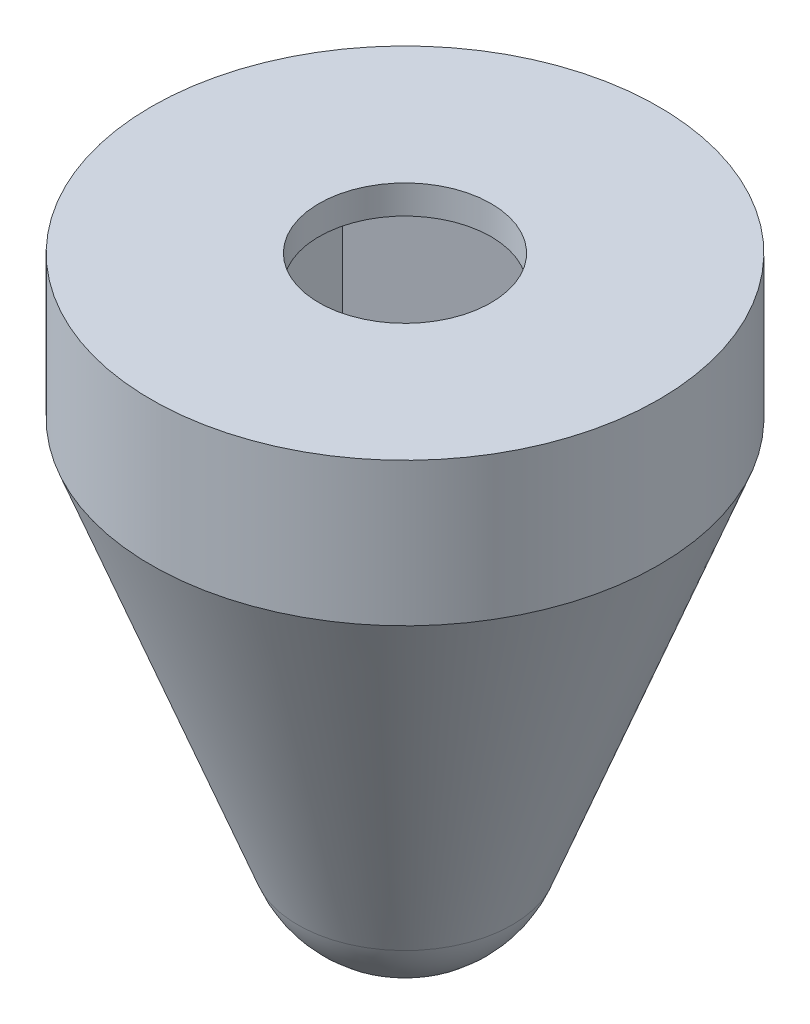
ISO-10303-21;
HEADER;
FILE_DESCRIPTION(('STEP AP214'),'2;1');
FILE_NAME('part.step','',(''),(''),'','','');
FILE_SCHEMA(('AUTOMOTIVE_DESIGN { 1 0 10303 214 1 1 1 1 }'));
ENDSEC;
DATA;
#1=APPLICATION_CONTEXT('core data for automotive mechanical design processes');
#2=APPLICATION_PROTOCOL_DEFINITION('international standard','automotive_design',2000,#1);
#3=PRODUCT_CONTEXT('',#1,'mechanical');
#4=PRODUCT('Part','Part','',(#3));
#5=PRODUCT_RELATED_PRODUCT_CATEGORY('part','',(#4));
#6=PRODUCT_DEFINITION_FORMATION('','',#4);
#7=PRODUCT_DEFINITION_CONTEXT('part definition',#1,'design');
#8=PRODUCT_DEFINITION('design','',#6,#7);
#9=PRODUCT_DEFINITION_SHAPE('','',#8);
#10=(LENGTH_UNIT() NAMED_UNIT(*) SI_UNIT(.MILLI.,.METRE.));
#11=(NAMED_UNIT(*) PLANE_ANGLE_UNIT() SI_UNIT($,.RADIAN.));
#12=(NAMED_UNIT(*) SI_UNIT($,.STERADIAN.) SOLID_ANGLE_UNIT());
#13=UNCERTAINTY_MEASURE_WITH_UNIT(LENGTH_MEASURE(1.E-05),#10,'distance_accuracy_value','');
#14=(GEOMETRIC_REPRESENTATION_CONTEXT(3) GLOBAL_UNCERTAINTY_ASSIGNED_CONTEXT((#13)) GLOBAL_UNIT_ASSIGNED_CONTEXT((#10,
#11,#12)) REPRESENTATION_CONTEXT('',''));
#15=CARTESIAN_POINT('',(0.,0.,0.));
#16=DIRECTION('',(0.,0.,1.));
#17=DIRECTION('',(1.,0.,0.));
#18=AXIS2_PLACEMENT_3D('',#15,#16,#17);
#19=CARTESIAN_POINT('',(0.,-6.71176596273646,0.));
#20=DIRECTION('',(0.,1.,0.));
#21=DIRECTION('',(-1.,0.,0.));
#22=AXIS2_PLACEMENT_3D('',#19,#20,#21);
#23=CONICAL_SURFACE('',#22,6.29406108556244,0.363858689170921);
#24=CARTESIAN_POINT('',(0.,0.,0.));
#25=DIRECTION('',(0.,1.,0.));
#26=DIRECTION('',(1.,0.,0.));
#27=AXIS2_PLACEMENT_3D('',#24,#25,#26);
#28=CIRCLE('',#27,8.85);
#29=CARTESIAN_POINT('',(8.85,0.,0.));
#30=VERTEX_POINT('',#29);
#31=EDGE_CURVE('E131',#30,#30,#28,.T.);
#32=ORIENTED_EDGE('',*,*,#31,.F.);
#33=DIRECTION('',(-0.35588293666471,-0.934530542781188,0.));
#34=VECTOR('',#33,1.);
#35=CARTESIAN_POINT('',(6.29406108556244,-6.71176596273646,0.));
#36=LINE('',#35,#34);
#37=CARTESIAN_POINT('',(3.73812217112487,-13.4235319254729,0.));
#38=VERTEX_POINT('',#37);
#39=EDGE_CURVE('E10',#30,#38,#36,.T.);
#40=ORIENTED_EDGE('',*,*,#39,.T.);
#41=CARTESIAN_POINT('',(0.,-13.4235319254729,0.));
#42=DIRECTION('',(0.,1.,0.));
#43=DIRECTION('',(1.,0.,0.));
#44=AXIS2_PLACEMENT_3D('',#41,#42,#43);
#45=CIRCLE('',#44,3.73812217112487);
#46=EDGE_CURVE('E18',#38,#38,#45,.T.);
#47=ORIENTED_EDGE('',*,*,#46,.T.);
#48=ORIENTED_EDGE('',*,*,#39,.F.);
#49=EDGE_LOOP('',(#32,#40,#47,#48));
#50=FACE_BOUND('',#49,.T.);
#51=ADVANCED_FACE('F15',(#50),#23,.T.);
#52=CARTESIAN_POINT('',(0.,-12.0000001788139,0.));
#53=DIRECTION('',(0.,0.,1.));
#54=DIRECTION('',(1.,0.,0.));
#55=AXIS2_PLACEMENT_3D('',#52,#53,#54);
#56=SPHERICAL_SURFACE('',#55,4.00000000000017);
#57=CARTESIAN_POINT('',(0.,-12.0000001788139,0.));
#58=DIRECTION('',(0.,1.,0.));
#59=DIRECTION('',(1.,0.,0.));
#60=AXIS2_PLACEMENT_3D('',#57,#58,#59);
#61=SPHERICAL_SURFACE('',#60,4.00000000000017);
#62=ORIENTED_EDGE('',*,*,#46,.F.);
#63=EDGE_LOOP('',(#62));
#64=FACE_BOUND('',#63,.T.);
#65=ADVANCED_FACE('F212',(#64),#61,.T.);
#66=CARTESIAN_POINT('',(0.,5.00000007450581,0.));
#67=DIRECTION('',(0.,1.,0.));
#68=DIRECTION('',(1.,0.,0.));
#69=AXIS2_PLACEMENT_3D('',#66,#67,#68);
#70=PLANE('',#69);
#71=CARTESIAN_POINT('',(0.,5.00000007450581,0.));
#72=DIRECTION('',(0.,-1.,0.));
#73=DIRECTION('',(0.,0.,1.));
#74=AXIS2_PLACEMENT_3D('',#71,#72,#73);
#75=CIRCLE('',#74,3.);
#76=CARTESIAN_POINT('',(0.,5.00000007450581,-3.));
#77=VERTEX_POINT('',#76);
#78=EDGE_CURVE('E99',#77,#77,#75,.T.);
#79=ORIENTED_EDGE('',*,*,#78,.T.);
#80=EDGE_LOOP('',(#79));
#81=FACE_BOUND('',#80,.T.);
#82=CARTESIAN_POINT('',(0.,5.00000007450581,0.));
#83=DIRECTION('',(0.,1.,0.));
#84=DIRECTION('',(1.,0.,0.));
#85=AXIS2_PLACEMENT_3D('',#82,#83,#84);
#86=CIRCLE('',#85,8.85);
#87=CARTESIAN_POINT('',(8.85,5.00000007450581,0.));
#88=VERTEX_POINT('',#87);
#89=EDGE_CURVE('E132',#88,#88,#86,.T.);
#90=ORIENTED_EDGE('',*,*,#89,.T.);
#91=EDGE_LOOP('',(#90));
#92=FACE_BOUND('',#91,.T.);
#93=ADVANCED_FACE('F106',(#81,#92),#70,.T.);
#94=CARTESIAN_POINT('',(0.,2.5000000372529,0.));
#95=DIRECTION('',(0.,1.,0.));
#96=DIRECTION('',(-1.,0.,0.));
#97=AXIS2_PLACEMENT_3D('',#94,#95,#96);
#98=CYLINDRICAL_SURFACE('',#97,8.85);
#99=ORIENTED_EDGE('',*,*,#89,.F.);
#100=DIRECTION('',(0.,-1.,0.));
#101=VECTOR('',#100,1.);
#102=CARTESIAN_POINT('',(8.85,2.5000000372529,0.));
#103=LINE('',#102,#101);
#104=EDGE_CURVE('E127',#88,#30,#103,.T.);
#105=ORIENTED_EDGE('',*,*,#104,.T.);
#106=ORIENTED_EDGE('',*,*,#31,.T.);
#107=ORIENTED_EDGE('',*,*,#104,.F.);
#108=EDGE_LOOP('',(#99,#105,#106,#107));
#109=FACE_BOUND('',#108,.T.);
#110=ADVANCED_FACE('F219',(#109),#98,.T.);
#111=CARTESIAN_POINT('',(0.,-2.,0.));
#112=DIRECTION('',(0.,1.,0.));
#113=DIRECTION('',(1.,0.,0.));
#114=AXIS2_PLACEMENT_3D('',#111,#112,#113);
#115=PLANE('',#114);
#116=DIRECTION('',(0.866025403784439,0.,0.5));
#117=VECTOR('',#116,1.);
#118=CARTESIAN_POINT('',(-5.15,-2.,2.97335388632657));
#119=LINE('',#118,#117);
#120=CARTESIAN_POINT('',(-5.15,-2.,2.97335388632657));
#121=VERTEX_POINT('',#120);
#122=CARTESIAN_POINT('',(0.,-2.,5.94670777265315));
#123=VERTEX_POINT('',#122);
#124=EDGE_CURVE('E147',#121,#123,#119,.T.);
#125=ORIENTED_EDGE('',*,*,#124,.T.);
#126=DIRECTION('',(0.866025403784439,0.,-0.5));
#127=VECTOR('',#126,1.);
#128=CARTESIAN_POINT('',(0.,-2.,5.94670777265315));
#129=LINE('',#128,#127);
#130=CARTESIAN_POINT('',(5.15,-2.,2.97335388632657));
#131=VERTEX_POINT('',#130);
#132=EDGE_CURVE('E133',#123,#131,#129,.T.);
#133=ORIENTED_EDGE('',*,*,#132,.T.);
#134=DIRECTION('',(0.,0.,-1.));
#135=VECTOR('',#134,1.);
#136=CARTESIAN_POINT('',(5.15,-2.,2.97335388632657));
#137=LINE('',#136,#135);
#138=CARTESIAN_POINT('',(5.15,-2.,-2.97335388632657));
#139=VERTEX_POINT('',#138);
#140=EDGE_CURVE('E159',#131,#139,#137,.T.);
#141=ORIENTED_EDGE('',*,*,#140,.T.);
#142=DIRECTION('',(-0.866025403784439,0.,-0.5));
#143=VECTOR('',#142,1.);
#144=CARTESIAN_POINT('',(5.15,-2.,-2.97335388632657));
#145=LINE('',#144,#143);
#146=CARTESIAN_POINT('',(0.,-2.,-5.94670777265315));
#147=VERTEX_POINT('',#146);
#148=EDGE_CURVE('E125',#139,#147,#145,.T.);
#149=ORIENTED_EDGE('',*,*,#148,.T.);
#150=DIRECTION('',(-0.866025403784439,0.,0.5));
#151=VECTOR('',#150,1.);
#152=CARTESIAN_POINT('',(0.,-2.,-5.94670777265315));
#153=LINE('',#152,#151);
#154=CARTESIAN_POINT('',(-5.15,-2.,-2.97335388632658));
#155=VERTEX_POINT('',#154);
#156=EDGE_CURVE('E126',#147,#155,#153,.T.);
#157=ORIENTED_EDGE('',*,*,#156,.T.);
#158=DIRECTION('',(0.,0.,1.));
#159=VECTOR('',#158,1.);
#160=CARTESIAN_POINT('',(-5.15,-2.,-2.97335388632658));
#161=LINE('',#160,#159);
#162=EDGE_CURVE('E103',#155,#121,#161,.T.);
#163=ORIENTED_EDGE('',*,*,#162,.T.);
#164=EDGE_LOOP('',(#125,#133,#141,#149,#157,#163));
#165=FACE_BOUND('',#164,.T.);
#166=ADVANCED_FACE('F192',(#165),#115,.T.);
#167=CARTESIAN_POINT('',(-5.15,-2.,2.97335388632657));
#168=DIRECTION('',(-0.5,0.,0.866025403784439));
#169=DIRECTION('',(0.,1.,0.));
#170=AXIS2_PLACEMENT_3D('',#167,#168,#169);
#171=PLANE('',#170);
#172=ORIENTED_EDGE('',*,*,#124,.F.);
#173=DIRECTION('',(0.,1.,0.));
#174=VECTOR('',#173,1.);
#175=CARTESIAN_POINT('',(-5.15,-2.,2.97335388632657));
#176=LINE('',#175,#174);
#177=CARTESIAN_POINT('',(-5.15,4.,2.97335388632657));
#178=VERTEX_POINT('',#177);
#179=EDGE_CURVE('E163',#121,#178,#176,.T.);
#180=ORIENTED_EDGE('',*,*,#179,.T.);
#181=DIRECTION('',(0.866025403784439,0.,0.5));
#182=VECTOR('',#181,1.);
#183=CARTESIAN_POINT('',(-5.15,4.,2.97335388632657));
#184=LINE('',#183,#182);
#185=CARTESIAN_POINT('',(0.,4.,5.94670777265315));
#186=VERTEX_POINT('',#185);
#187=EDGE_CURVE('E143',#178,#186,#184,.T.);
#188=ORIENTED_EDGE('',*,*,#187,.T.);
#189=DIRECTION('',(0.,1.,0.));
#190=VECTOR('',#189,1.);
#191=CARTESIAN_POINT('',(0.,-2.,5.94670777265315));
#192=LINE('',#191,#190);
#193=EDGE_CURVE('E135',#123,#186,#192,.T.);
#194=ORIENTED_EDGE('',*,*,#193,.F.);
#195=EDGE_LOOP('',(#172,#180,#188,#194));
#196=FACE_BOUND('',#195,.T.);
#197=ADVANCED_FACE('F202',(#196),#171,.F.);
#198=CARTESIAN_POINT('',(0.,-2.,5.94670777265315));
#199=DIRECTION('',(0.5,0.,0.866025403784439));
#200=DIRECTION('',(0.,-1.,0.));
#201=AXIS2_PLACEMENT_3D('',#198,#199,#200);
#202=PLANE('',#201);
#203=ORIENTED_EDGE('',*,*,#132,.F.);
#204=ORIENTED_EDGE('',*,*,#193,.T.);
#205=DIRECTION('',(0.866025403784439,0.,-0.5));
#206=VECTOR('',#205,1.);
#207=CARTESIAN_POINT('',(0.,4.,5.94670777265315));
#208=LINE('',#207,#206);
#209=CARTESIAN_POINT('',(5.15,4.,2.97335388632657));
#210=VERTEX_POINT('',#209);
#211=EDGE_CURVE('E114',#186,#210,#208,.T.);
#212=ORIENTED_EDGE('',*,*,#211,.T.);
#213=DIRECTION('',(0.,1.,0.));
#214=VECTOR('',#213,1.);
#215=CARTESIAN_POINT('',(5.15,-2.,2.97335388632657));
#216=LINE('',#215,#214);
#217=EDGE_CURVE('E136',#131,#210,#216,.T.);
#218=ORIENTED_EDGE('',*,*,#217,.F.);
#219=EDGE_LOOP('',(#203,#204,#212,#218));
#220=FACE_BOUND('',#219,.T.);
#221=ADVANCED_FACE('F247',(#220),#202,.F.);
#222=CARTESIAN_POINT('',(5.15,-2.,2.97335388632657));
#223=DIRECTION('',(1.,0.,0.));
#224=DIRECTION('',(0.,0.,1.));
#225=AXIS2_PLACEMENT_3D('',#222,#223,#224);
#226=PLANE('',#225);
#227=ORIENTED_EDGE('',*,*,#140,.F.);
#228=ORIENTED_EDGE('',*,*,#217,.T.);
#229=DIRECTION('',(0.,0.,-1.));
#230=VECTOR('',#229,1.);
#231=CARTESIAN_POINT('',(5.15,4.,2.97335388632657));
#232=LINE('',#231,#230);
#233=CARTESIAN_POINT('',(5.15,4.,-2.97335388632657));
#234=VERTEX_POINT('',#233);
#235=EDGE_CURVE('E117',#210,#234,#232,.T.);
#236=ORIENTED_EDGE('',*,*,#235,.T.);
#237=DIRECTION('',(0.,1.,0.));
#238=VECTOR('',#237,1.);
#239=CARTESIAN_POINT('',(5.15,-2.,-2.97335388632657));
#240=LINE('',#239,#238);
#241=EDGE_CURVE('E179',#139,#234,#240,.T.);
#242=ORIENTED_EDGE('',*,*,#241,.F.);
#243=EDGE_LOOP('',(#227,#228,#236,#242));
#244=FACE_BOUND('',#243,.T.);
#245=ADVANCED_FACE('F281',(#244),#226,.F.);
#246=CARTESIAN_POINT('',(5.15,-2.,-2.97335388632657));
#247=DIRECTION('',(0.5,0.,-0.866025403784439));
#248=DIRECTION('',(0.,-1.,0.));
#249=AXIS2_PLACEMENT_3D('',#246,#247,#248);
#250=PLANE('',#249);
#251=ORIENTED_EDGE('',*,*,#148,.F.);
#252=ORIENTED_EDGE('',*,*,#241,.T.);
#253=DIRECTION('',(-0.866025403784439,0.,-0.5));
#254=VECTOR('',#253,1.);
#255=CARTESIAN_POINT('',(5.15,4.,-2.97335388632657));
#256=LINE('',#255,#254);
#257=CARTESIAN_POINT('',(0.,4.,-5.94670777265315));
#258=VERTEX_POINT('',#257);
#259=EDGE_CURVE('E121',#234,#258,#256,.T.);
#260=ORIENTED_EDGE('',*,*,#259,.T.);
#261=DIRECTION('',(0.,1.,0.));
#262=VECTOR('',#261,1.);
#263=CARTESIAN_POINT('',(0.,-2.,-5.94670777265315));
#264=LINE('',#263,#262);
#265=EDGE_CURVE('E122',#147,#258,#264,.T.);
#266=ORIENTED_EDGE('',*,*,#265,.F.);
#267=EDGE_LOOP('',(#251,#252,#260,#266));
#268=FACE_BOUND('',#267,.T.);
#269=ADVANCED_FACE('F286',(#268),#250,.F.);
#270=CARTESIAN_POINT('',(0.,-2.,-5.94670777265315));
#271=DIRECTION('',(-0.5,0.,-0.866025403784439));
#272=DIRECTION('',(-0.866025403784439,0.,0.5));
#273=AXIS2_PLACEMENT_3D('',#270,#271,#272);
#274=PLANE('',#273);
#275=ORIENTED_EDGE('',*,*,#156,.F.);
#276=ORIENTED_EDGE('',*,*,#265,.T.);
#277=DIRECTION('',(-0.866025403784439,0.,0.5));
#278=VECTOR('',#277,1.);
#279=CARTESIAN_POINT('',(0.,4.,-5.94670777265315));
#280=LINE('',#279,#278);
#281=CARTESIAN_POINT('',(-5.15,4.,-2.97335388632658));
#282=VERTEX_POINT('',#281);
#283=EDGE_CURVE('E142',#258,#282,#280,.T.);
#284=ORIENTED_EDGE('',*,*,#283,.T.);
#285=DIRECTION('',(0.,1.,0.));
#286=VECTOR('',#285,1.);
#287=CARTESIAN_POINT('',(-5.15,-2.,-2.97335388632658));
#288=LINE('',#287,#286);
#289=EDGE_CURVE('E160',#155,#282,#288,.T.);
#290=ORIENTED_EDGE('',*,*,#289,.F.);
#291=EDGE_LOOP('',(#275,#276,#284,#290));
#292=FACE_BOUND('',#291,.T.);
#293=ADVANCED_FACE('F257',(#292),#274,.F.);
#294=CARTESIAN_POINT('',(-5.15,-2.,-2.97335388632658));
#295=DIRECTION('',(-1.,0.,0.));
#296=DIRECTION('',(0.,0.,1.));
#297=AXIS2_PLACEMENT_3D('',#294,#295,#296);
#298=PLANE('',#297);
#299=ORIENTED_EDGE('',*,*,#162,.F.);
#300=ORIENTED_EDGE('',*,*,#289,.T.);
#301=DIRECTION('',(0.,0.,1.));
#302=VECTOR('',#301,1.);
#303=CARTESIAN_POINT('',(-5.15,4.,-2.97335388632658));
#304=LINE('',#303,#302);
#305=EDGE_CURVE('E138',#282,#178,#304,.T.);
#306=ORIENTED_EDGE('',*,*,#305,.T.);
#307=ORIENTED_EDGE('',*,*,#179,.F.);
#308=EDGE_LOOP('',(#299,#300,#306,#307));
#309=FACE_BOUND('',#308,.T.);
#310=ADVANCED_FACE('F198',(#309),#298,.F.);
#311=CARTESIAN_POINT('',(0.,2.50000007450581,0.));
#312=DIRECTION('',(0.,-1.,0.));
#313=DIRECTION('',(0.,0.,1.));
#314=AXIS2_PLACEMENT_3D('',#311,#312,#313);
#315=CYLINDRICAL_SURFACE('',#314,3.);
#316=ORIENTED_EDGE('',*,*,#78,.F.);
#317=DIRECTION('',(0.,-1.,0.));
#318=VECTOR('',#317,1.);
#319=CARTESIAN_POINT('',(0.,2.50000007450581,-3.));
#320=LINE('',#319,#318);
#321=CARTESIAN_POINT('',(0.,4.,-3.));
#322=VERTEX_POINT('',#321);
#323=EDGE_CURVE('E96',#77,#322,#320,.T.);
#324=ORIENTED_EDGE('',*,*,#323,.T.);
#325=CARTESIAN_POINT('',(0.,4.,0.));
#326=DIRECTION('',(0.,-1.,0.));
#327=DIRECTION('',(0.,0.,1.));
#328=AXIS2_PLACEMENT_3D('',#325,#326,#327);
#329=CIRCLE('',#328,3.);
#330=EDGE_CURVE('E101',#322,#322,#329,.T.);
#331=ORIENTED_EDGE('',*,*,#330,.T.);
#332=ORIENTED_EDGE('',*,*,#323,.F.);
#333=EDGE_LOOP('',(#316,#324,#331,#332));
#334=FACE_BOUND('',#333,.T.);
#335=ADVANCED_FACE('F98',(#334),#315,.F.);
#336=CARTESIAN_POINT('',(0.,4.,0.));
#337=DIRECTION('',(0.,1.,0.));
#338=DIRECTION('',(1.,0.,0.));
#339=AXIS2_PLACEMENT_3D('',#336,#337,#338);
#340=PLANE('',#339);
#341=ORIENTED_EDGE('',*,*,#330,.F.);
#342=EDGE_LOOP('',(#341));
#343=FACE_BOUND('',#342,.T.);
#344=ORIENTED_EDGE('',*,*,#187,.F.);
#345=ORIENTED_EDGE('',*,*,#305,.F.);
#346=ORIENTED_EDGE('',*,*,#283,.F.);
#347=ORIENTED_EDGE('',*,*,#259,.F.);
#348=ORIENTED_EDGE('',*,*,#235,.F.);
#349=ORIENTED_EDGE('',*,*,#211,.F.);
#350=EDGE_LOOP('',(#344,#345,#346,#347,#348,#349));
#351=FACE_BOUND('',#350,.T.);
#352=ADVANCED_FACE('F235',(#343,#351),#340,.F.);
#353=CLOSED_SHELL('',(#51,#65,#93,#110,#166,#197,#221,#245,#269,#293,#310,#335,#352));
#354=MANIFOLD_SOLID_BREP('B1',#353);
#355=ADVANCED_BREP_SHAPE_REPRESENTATION('',(#18,#354),#14);
#356=SHAPE_DEFINITION_REPRESENTATION(#9,#355);
ENDSEC;
END-ISO-10303-21;
